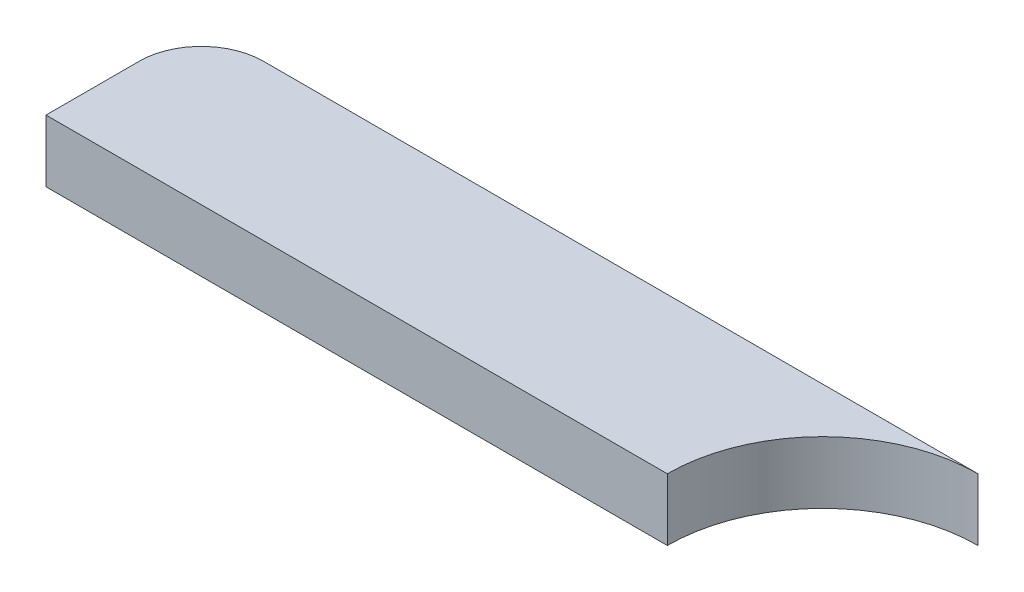
ISO-10303-21;
HEADER;
FILE_DESCRIPTION(('STEP AP214'),'2;1');
FILE_NAME('part.step','',(''),(''),'','','');
FILE_SCHEMA(('AUTOMOTIVE_DESIGN { 1 0 10303 214 1 1 1 1 }'));
ENDSEC;
DATA;
#1=APPLICATION_CONTEXT('core data for automotive mechanical design processes');
#2=APPLICATION_PROTOCOL_DEFINITION('international standard','automotive_design',2000,#1);
#3=PRODUCT_CONTEXT('',#1,'mechanical');
#4=PRODUCT('Part','Part','',(#3));
#5=PRODUCT_RELATED_PRODUCT_CATEGORY('part','',(#4));
#6=PRODUCT_DEFINITION_FORMATION('','',#4);
#7=PRODUCT_DEFINITION_CONTEXT('part definition',#1,'design');
#8=PRODUCT_DEFINITION('design','',#6,#7);
#9=PRODUCT_DEFINITION_SHAPE('','',#8);
#10=(LENGTH_UNIT() NAMED_UNIT(*) SI_UNIT(.MILLI.,.METRE.));
#11=(NAMED_UNIT(*) PLANE_ANGLE_UNIT() SI_UNIT($,.RADIAN.));
#12=(NAMED_UNIT(*) SI_UNIT($,.STERADIAN.) SOLID_ANGLE_UNIT());
#13=UNCERTAINTY_MEASURE_WITH_UNIT(LENGTH_MEASURE(1.E-05),#10,'distance_accuracy_value','');
#14=(GEOMETRIC_REPRESENTATION_CONTEXT(3) GLOBAL_UNCERTAINTY_ASSIGNED_CONTEXT((#13)) GLOBAL_UNIT_ASSIGNED_CONTEXT((#10,
#11,#12)) REPRESENTATION_CONTEXT('',''));
#15=CARTESIAN_POINT('',(0.,0.,0.));
#16=DIRECTION('',(0.,0.,1.));
#17=DIRECTION('',(1.,0.,0.));
#18=AXIS2_PLACEMENT_3D('',#15,#16,#17);
#19=CARTESIAN_POINT('',(0.,2.,0.));
#20=DIRECTION('',(0.,-1.,0.));
#21=DIRECTION('',(0.,0.,-1.));
#22=AXIS2_PLACEMENT_3D('',#19,#20,#21);
#23=CYLINDRICAL_SURFACE('',#22,5.);
#24=CARTESIAN_POINT('',(0.,0.,0.));
#25=DIRECTION('',(0.,1.,0.));
#26=DIRECTION('',(0.,0.,1.));
#27=AXIS2_PLACEMENT_3D('',#24,#25,#26);
#28=CIRCLE('',#27,5.);
#29=CARTESIAN_POINT('',(0.,0.,-5.));
#30=VERTEX_POINT('',#29);
#31=CARTESIAN_POINT('',(-5.,0.,0.));
#32=VERTEX_POINT('',#31);
#33=EDGE_CURVE('E92',#30,#32,#28,.T.);
#34=ORIENTED_EDGE('',*,*,#33,.F.);
#35=DIRECTION('',(0.,-1.,0.));
#36=VECTOR('',#35,1.);
#37=CARTESIAN_POINT('',(0.,2.,-5.));
#38=LINE('',#37,#36);
#39=CARTESIAN_POINT('',(0.,2.,-5.));
#40=VERTEX_POINT('',#39);
#41=EDGE_CURVE('E81',#40,#30,#38,.T.);
#42=ORIENTED_EDGE('',*,*,#41,.F.);
#43=CARTESIAN_POINT('',(0.,2.,0.));
#44=DIRECTION('',(0.,1.,0.));
#45=DIRECTION('',(0.,0.,1.));
#46=AXIS2_PLACEMENT_3D('',#43,#44,#45);
#47=CIRCLE('',#46,5.);
#48=CARTESIAN_POINT('',(-5.,2.,0.));
#49=VERTEX_POINT('',#48);
#50=EDGE_CURVE('E87',#40,#49,#47,.T.);
#51=ORIENTED_EDGE('',*,*,#50,.T.);
#52=DIRECTION('',(0.,-1.,0.));
#53=VECTOR('',#52,1.);
#54=CARTESIAN_POINT('',(-5.,2.,0.));
#55=LINE('',#54,#53);
#56=EDGE_CURVE('E108',#49,#32,#55,.T.);
#57=ORIENTED_EDGE('',*,*,#56,.T.);
#58=EDGE_LOOP('',(#34,#42,#51,#57));
#59=FACE_BOUND('',#58,.T.);
#60=ADVANCED_FACE('F35',(#59),#23,.F.);
#61=CARTESIAN_POINT('',(0.,2.,-5.));
#62=DIRECTION('',(0.,0.,-1.));
#63=DIRECTION('',(-1.,0.,0.));
#64=AXIS2_PLACEMENT_3D('',#61,#62,#63);
#65=PLANE('',#64);
#66=DIRECTION('',(1.,0.,0.));
#67=VECTOR('',#66,1.);
#68=CARTESIAN_POINT('',(0.,0.,-5.));
#69=LINE('',#68,#67);
#70=CARTESIAN_POINT('',(-23.,0.,-5.));
#71=VERTEX_POINT('',#70);
#72=EDGE_CURVE('E110',#71,#30,#69,.T.);
#73=ORIENTED_EDGE('',*,*,#72,.F.);
#74=DIRECTION('',(0.,-1.,0.));
#75=VECTOR('',#74,1.);
#76=CARTESIAN_POINT('',(-23.,2.,-5.));
#77=LINE('',#76,#75);
#78=CARTESIAN_POINT('',(-23.,2.,-5.));
#79=VERTEX_POINT('',#78);
#80=EDGE_CURVE('E43',#71,#79,#77,.F.);
#81=ORIENTED_EDGE('',*,*,#80,.T.);
#82=DIRECTION('',(1.,0.,0.));
#83=VECTOR('',#82,1.);
#84=CARTESIAN_POINT('',(0.,2.,-5.));
#85=LINE('',#84,#83);
#86=EDGE_CURVE('E78',#79,#40,#85,.T.);
#87=ORIENTED_EDGE('',*,*,#86,.T.);
#88=ORIENTED_EDGE('',*,*,#41,.T.);
#89=EDGE_LOOP('',(#73,#81,#87,#88));
#90=FACE_BOUND('',#89,.T.);
#91=ADVANCED_FACE('F80',(#90),#65,.T.);
#92=CARTESIAN_POINT('',(-25.,2.,0.));
#93=DIRECTION('',(1.,0.,0.));
#94=DIRECTION('',(0.,0.,-1.));
#95=AXIS2_PLACEMENT_3D('',#92,#93,#94);
#96=PLANE('',#95);
#97=DIRECTION('',(0.,0.,1.));
#98=VECTOR('',#97,1.);
#99=CARTESIAN_POINT('',(-25.,2.,0.));
#100=LINE('',#99,#98);
#101=CARTESIAN_POINT('',(-25.,2.,-3.));
#102=VERTEX_POINT('',#101);
#103=CARTESIAN_POINT('',(-25.,2.,0.));
#104=VERTEX_POINT('',#103);
#105=EDGE_CURVE('E86',#102,#104,#100,.T.);
#106=ORIENTED_EDGE('',*,*,#105,.F.);
#107=DIRECTION('',(0.,-1.,0.));
#108=VECTOR('',#107,1.);
#109=CARTESIAN_POINT('',(-25.,0.,-3.));
#110=LINE('',#109,#108);
#111=CARTESIAN_POINT('',(-25.,0.,-3.));
#112=VERTEX_POINT('',#111);
#113=EDGE_CURVE('E93',#102,#112,#110,.T.);
#114=ORIENTED_EDGE('',*,*,#113,.T.);
#115=DIRECTION('',(0.,0.,1.));
#116=VECTOR('',#115,1.);
#117=CARTESIAN_POINT('',(-25.,0.,0.));
#118=LINE('',#117,#116);
#119=CARTESIAN_POINT('',(-25.,0.,0.));
#120=VERTEX_POINT('',#119);
#121=EDGE_CURVE('E103',#112,#120,#118,.T.);
#122=ORIENTED_EDGE('',*,*,#121,.T.);
#123=DIRECTION('',(0.,-1.,0.));
#124=VECTOR('',#123,1.);
#125=CARTESIAN_POINT('',(-25.,2.,0.));
#126=LINE('',#125,#124);
#127=EDGE_CURVE('E94',#104,#120,#126,.T.);
#128=ORIENTED_EDGE('',*,*,#127,.F.);
#129=EDGE_LOOP('',(#106,#114,#122,#128));
#130=FACE_BOUND('',#129,.T.);
#131=ADVANCED_FACE('F121',(#130),#96,.F.);
#132=CARTESIAN_POINT('',(0.,2.,0.));
#133=DIRECTION('',(0.,0.,-1.));
#134=DIRECTION('',(-1.,0.,0.));
#135=AXIS2_PLACEMENT_3D('',#132,#133,#134);
#136=PLANE('',#135);
#137=DIRECTION('',(1.,0.,0.));
#138=VECTOR('',#137,1.);
#139=CARTESIAN_POINT('',(0.,0.,0.));
#140=LINE('',#139,#138);
#141=EDGE_CURVE('E100',#120,#32,#140,.T.);
#142=ORIENTED_EDGE('',*,*,#141,.T.);
#143=ORIENTED_EDGE('',*,*,#56,.F.);
#144=DIRECTION('',(1.,0.,0.));
#145=VECTOR('',#144,1.);
#146=CARTESIAN_POINT('',(0.,2.,0.));
#147=LINE('',#146,#145);
#148=EDGE_CURVE('E98',#104,#49,#147,.T.);
#149=ORIENTED_EDGE('',*,*,#148,.F.);
#150=ORIENTED_EDGE('',*,*,#127,.T.);
#151=EDGE_LOOP('',(#142,#143,#149,#150));
#152=FACE_BOUND('',#151,.T.);
#153=ADVANCED_FACE('F127',(#152),#136,.F.);
#154=CARTESIAN_POINT('',(0.,2.,0.));
#155=DIRECTION('',(0.,1.,0.));
#156=DIRECTION('',(0.,0.,1.));
#157=AXIS2_PLACEMENT_3D('',#154,#155,#156);
#158=PLANE('',#157);
#159=ORIENTED_EDGE('',*,*,#86,.F.);
#160=CARTESIAN_POINT('',(-23.,2.,-3.));
#161=DIRECTION('',(0.,1.,0.));
#162=DIRECTION('',(0.,0.,1.));
#163=AXIS2_PLACEMENT_3D('',#160,#161,#162);
#164=CIRCLE('',#163,2.);
#165=EDGE_CURVE('E11',#79,#102,#164,.T.);
#166=ORIENTED_EDGE('',*,*,#165,.T.);
#167=ORIENTED_EDGE('',*,*,#105,.T.);
#168=ORIENTED_EDGE('',*,*,#148,.T.);
#169=ORIENTED_EDGE('',*,*,#50,.F.);
#170=EDGE_LOOP('',(#159,#166,#167,#168,#169));
#171=FACE_BOUND('',#170,.T.);
#172=ADVANCED_FACE('F96',(#171),#158,.T.);
#173=CARTESIAN_POINT('',(0.,0.,0.));
#174=DIRECTION('',(0.,1.,0.));
#175=DIRECTION('',(0.,0.,1.));
#176=AXIS2_PLACEMENT_3D('',#173,#174,#175);
#177=PLANE('',#176);
#178=ORIENTED_EDGE('',*,*,#121,.F.);
#179=CARTESIAN_POINT('',(-23.,0.,-3.));
#180=DIRECTION('',(0.,1.,0.));
#181=DIRECTION('',(0.,0.,1.));
#182=AXIS2_PLACEMENT_3D('',#179,#180,#181);
#183=CIRCLE('',#182,2.);
#184=EDGE_CURVE('E57',#112,#71,#183,.F.);
#185=ORIENTED_EDGE('',*,*,#184,.T.);
#186=ORIENTED_EDGE('',*,*,#72,.T.);
#187=ORIENTED_EDGE('',*,*,#33,.T.);
#188=ORIENTED_EDGE('',*,*,#141,.F.);
#189=EDGE_LOOP('',(#178,#185,#186,#187,#188));
#190=FACE_BOUND('',#189,.T.);
#191=ADVANCED_FACE('F125',(#190),#177,.F.);
#192=CARTESIAN_POINT('',(-23.,2.,-3.));
#193=DIRECTION('',(0.,1.,0.));
#194=DIRECTION('',(0.,0.,1.));
#195=AXIS2_PLACEMENT_3D('',#192,#193,#194);
#196=CYLINDRICAL_SURFACE('',#195,2.);
#197=ORIENTED_EDGE('',*,*,#165,.F.);
#198=ORIENTED_EDGE('',*,*,#80,.F.);
#199=ORIENTED_EDGE('',*,*,#184,.F.);
#200=ORIENTED_EDGE('',*,*,#113,.F.);
#201=EDGE_LOOP('',(#197,#198,#199,#200));
#202=FACE_BOUND('',#201,.T.);
#203=ADVANCED_FACE('F37',(#202),#196,.T.);
#204=CLOSED_SHELL('',(#60,#91,#131,#153,#172,#191,#203));
#205=MANIFOLD_SOLID_BREP('B2',#204);
#206=ADVANCED_BREP_SHAPE_REPRESENTATION('',(#18,#205),#14);
#207=SHAPE_DEFINITION_REPRESENTATION(#9,#206);
ENDSEC;
END-ISO-10303-21;
